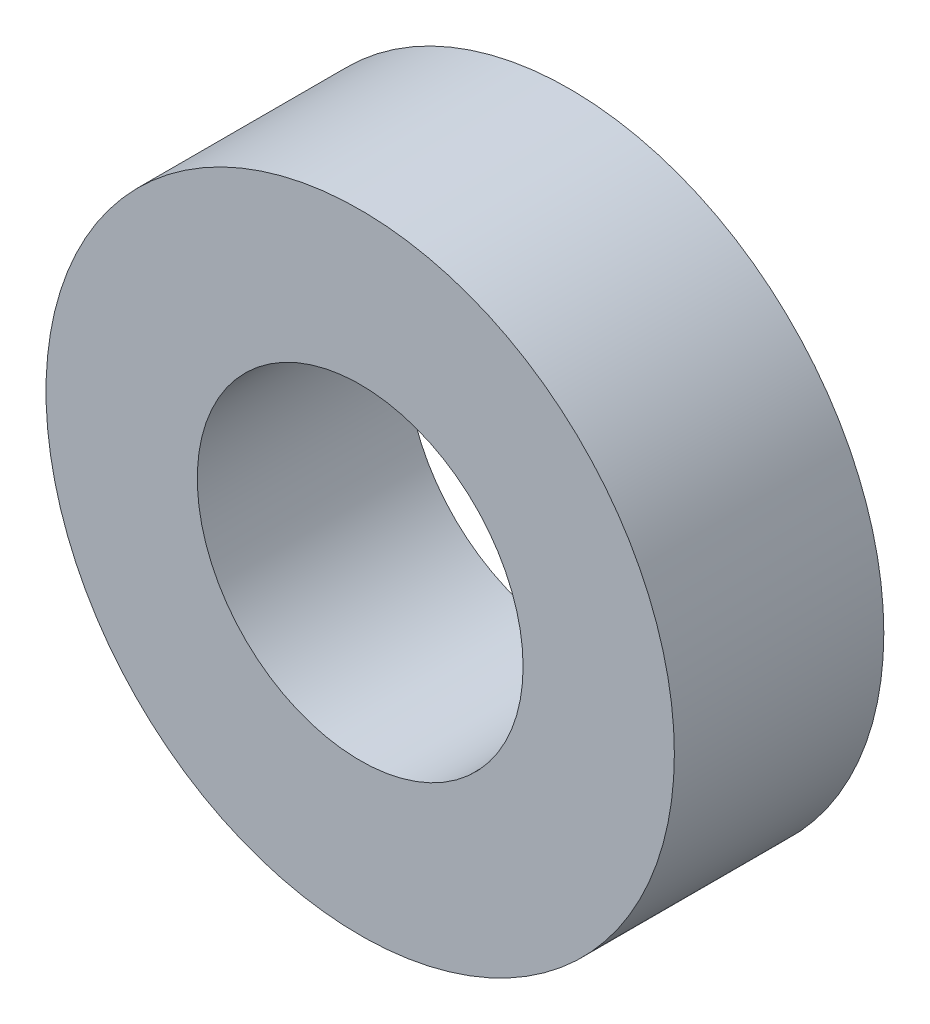
ISO-10303-21;
HEADER;
FILE_DESCRIPTION(('STEP AP214'),'2;1');
FILE_NAME('part.step','',(''),(''),'','','');
FILE_SCHEMA(('AUTOMOTIVE_DESIGN { 1 0 10303 214 1 1 1 1 }'));
ENDSEC;
DATA;
#1=APPLICATION_CONTEXT('core data for automotive mechanical design processes');
#2=APPLICATION_PROTOCOL_DEFINITION('international standard','automotive_design',2000,#1);
#3=PRODUCT_CONTEXT('',#1,'mechanical');
#4=PRODUCT('Part','Part','',(#3));
#5=PRODUCT_RELATED_PRODUCT_CATEGORY('part','',(#4));
#6=PRODUCT_DEFINITION_FORMATION('','',#4);
#7=PRODUCT_DEFINITION_CONTEXT('part definition',#1,'design');
#8=PRODUCT_DEFINITION('design','',#6,#7);
#9=PRODUCT_DEFINITION_SHAPE('','',#8);
#10=(LENGTH_UNIT() NAMED_UNIT(*) SI_UNIT(.MILLI.,.METRE.));
#11=(NAMED_UNIT(*) PLANE_ANGLE_UNIT() SI_UNIT($,.RADIAN.));
#12=(NAMED_UNIT(*) SI_UNIT($,.STERADIAN.) SOLID_ANGLE_UNIT());
#13=UNCERTAINTY_MEASURE_WITH_UNIT(LENGTH_MEASURE(1.E-05),#10,'distance_accuracy_value','');
#14=(GEOMETRIC_REPRESENTATION_CONTEXT(3) GLOBAL_UNCERTAINTY_ASSIGNED_CONTEXT((#13)) GLOBAL_UNIT_ASSIGNED_CONTEXT((#10,
#11,#12)) REPRESENTATION_CONTEXT('',''));
#15=CARTESIAN_POINT('',(0.,0.,0.));
#16=DIRECTION('',(0.,0.,1.));
#17=DIRECTION('',(1.,0.,0.));
#18=AXIS2_PLACEMENT_3D('',#15,#16,#17);
#19=CARTESIAN_POINT('',(0.,0.,9.));
#20=DIRECTION('',(0.,0.,1.));
#21=DIRECTION('',(1.,0.,0.));
#22=AXIS2_PLACEMENT_3D('',#19,#20,#21);
#23=PLANE('',#22);
#24=CARTESIAN_POINT('',(0.,0.,9.));
#25=DIRECTION('',(0.,0.,1.));
#26=DIRECTION('',(1.,0.,0.));
#27=AXIS2_PLACEMENT_3D('',#24,#25,#26);
#28=CIRCLE('',#27,13.5);
#29=CARTESIAN_POINT('',(13.5,0.,9.));
#30=VERTEX_POINT('',#29);
#31=EDGE_CURVE('E10',#30,#30,#28,.T.);
#32=ORIENTED_EDGE('',*,*,#31,.T.);
#33=EDGE_LOOP('',(#32));
#34=FACE_BOUND('',#33,.T.);
#35=CARTESIAN_POINT('',(0.,0.,9.));
#36=DIRECTION('',(0.,0.,1.));
#37=DIRECTION('',(1.,0.,0.));
#38=AXIS2_PLACEMENT_3D('',#35,#36,#37);
#39=CIRCLE('',#38,7.);
#40=CARTESIAN_POINT('',(7.,0.,9.));
#41=VERTEX_POINT('',#40);
#42=EDGE_CURVE('E45',#41,#41,#39,.T.);
#43=ORIENTED_EDGE('',*,*,#42,.F.);
#44=EDGE_LOOP('',(#43));
#45=FACE_BOUND('',#44,.T.);
#46=ADVANCED_FACE('F34',(#34,#45),#23,.T.);
#47=CARTESIAN_POINT('',(0.,0.,0.));
#48=DIRECTION('',(0.,0.,1.));
#49=DIRECTION('',(1.,0.,0.));
#50=AXIS2_PLACEMENT_3D('',#47,#48,#49);
#51=PLANE('',#50);
#52=CARTESIAN_POINT('',(0.,0.,0.));
#53=DIRECTION('',(0.,0.,1.));
#54=DIRECTION('',(1.,0.,0.));
#55=AXIS2_PLACEMENT_3D('',#52,#53,#54);
#56=CIRCLE('',#55,13.5);
#57=CARTESIAN_POINT('',(13.5,0.,0.));
#58=VERTEX_POINT('',#57);
#59=EDGE_CURVE('E38',#58,#58,#56,.T.);
#60=ORIENTED_EDGE('',*,*,#59,.F.);
#61=EDGE_LOOP('',(#60));
#62=FACE_BOUND('',#61,.T.);
#63=CARTESIAN_POINT('',(0.,0.,0.));
#64=DIRECTION('',(0.,0.,1.));
#65=DIRECTION('',(1.,0.,0.));
#66=AXIS2_PLACEMENT_3D('',#63,#64,#65);
#67=CIRCLE('',#66,7.);
#68=CARTESIAN_POINT('',(7.,0.,0.));
#69=VERTEX_POINT('',#68);
#70=EDGE_CURVE('E47',#69,#69,#67,.T.);
#71=ORIENTED_EDGE('',*,*,#70,.T.);
#72=EDGE_LOOP('',(#71));
#73=FACE_BOUND('',#72,.T.);
#74=ADVANCED_FACE('F57',(#62,#73),#51,.F.);
#75=CARTESIAN_POINT('',(0.,0.,9.));
#76=DIRECTION('',(0.,0.,-1.));
#77=DIRECTION('',(-1.,0.,0.));
#78=AXIS2_PLACEMENT_3D('',#75,#76,#77);
#79=CYLINDRICAL_SURFACE('',#78,13.5);
#80=ORIENTED_EDGE('',*,*,#31,.F.);
#81=EDGE_LOOP('',(#80));
#82=FACE_BOUND('',#81,.T.);
#83=ORIENTED_EDGE('',*,*,#59,.T.);
#84=EDGE_LOOP('',(#83));
#85=FACE_BOUND('',#84,.T.);
#86=ADVANCED_FACE('F36',(#82,#85),#79,.T.);
#87=CARTESIAN_POINT('',(0.,0.,9.));
#88=DIRECTION('',(0.,0.,-1.));
#89=DIRECTION('',(-1.,0.,0.));
#90=AXIS2_PLACEMENT_3D('',#87,#88,#89);
#91=CYLINDRICAL_SURFACE('',#90,7.);
#92=ORIENTED_EDGE('',*,*,#42,.T.);
#93=EDGE_LOOP('',(#92));
#94=FACE_BOUND('',#93,.T.);
#95=ORIENTED_EDGE('',*,*,#70,.F.);
#96=EDGE_LOOP('',(#95));
#97=FACE_BOUND('',#96,.T.);
#98=ADVANCED_FACE('F53',(#94,#97),#91,.F.);
#99=CLOSED_SHELL('',(#46,#74,#86,#98));
#100=MANIFOLD_SOLID_BREP('B2',#99);
#101=ADVANCED_BREP_SHAPE_REPRESENTATION('',(#18,#100),#14);
#102=SHAPE_DEFINITION_REPRESENTATION(#9,#101);
ENDSEC;
END-ISO-10303-21;
